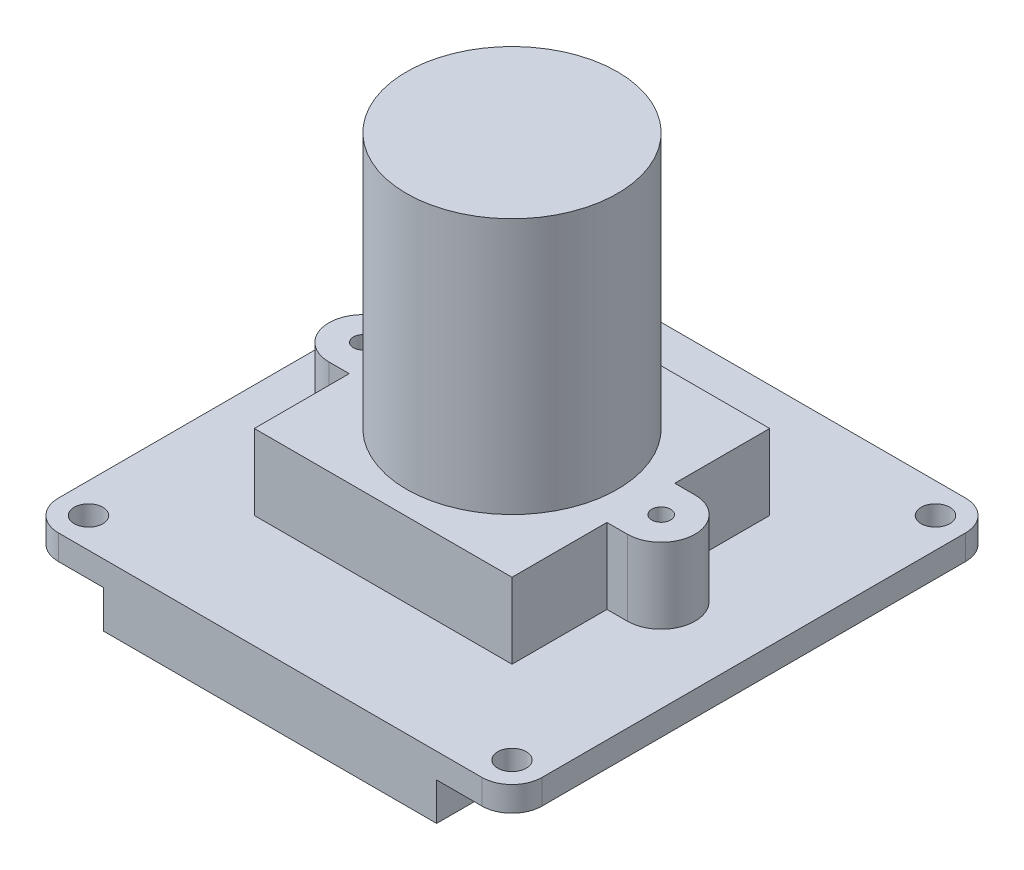
ISO-10303-21;
HEADER;
FILE_DESCRIPTION(('STEP AP214'),'2;1');
FILE_NAME('part.step','',(''),(''),'','','');
FILE_SCHEMA(('AUTOMOTIVE_DESIGN { 1 0 10303 214 1 1 1 1 }'));
ENDSEC;
DATA;
#1=APPLICATION_CONTEXT('core data for automotive mechanical design processes');
#2=APPLICATION_PROTOCOL_DEFINITION('international standard','automotive_design',2000,#1);
#3=PRODUCT_CONTEXT('',#1,'mechanical');
#4=PRODUCT('Part','Part','',(#3));
#5=PRODUCT_RELATED_PRODUCT_CATEGORY('part','',(#4));
#6=PRODUCT_DEFINITION_FORMATION('','',#4);
#7=PRODUCT_DEFINITION_CONTEXT('part definition',#1,'design');
#8=PRODUCT_DEFINITION('design','',#6,#7);
#9=PRODUCT_DEFINITION_SHAPE('','',#8);
#10=(LENGTH_UNIT() NAMED_UNIT(*) SI_UNIT(.MILLI.,.METRE.));
#11=(NAMED_UNIT(*) PLANE_ANGLE_UNIT() SI_UNIT($,.RADIAN.));
#12=(NAMED_UNIT(*) SI_UNIT($,.STERADIAN.) SOLID_ANGLE_UNIT());
#13=UNCERTAINTY_MEASURE_WITH_UNIT(LENGTH_MEASURE(1.E-05),#10,'distance_accuracy_value','');
#14=(GEOMETRIC_REPRESENTATION_CONTEXT(3) GLOBAL_UNCERTAINTY_ASSIGNED_CONTEXT((#13)) GLOBAL_UNIT_ASSIGNED_CONTEXT((#10,
#11,#12)) REPRESENTATION_CONTEXT('',''));
#15=CARTESIAN_POINT('',(0.,0.,0.));
#16=DIRECTION('',(0.,0.,1.));
#17=DIRECTION('',(1.,0.,0.));
#18=AXIS2_PLACEMENT_3D('',#15,#16,#17);
#19=CARTESIAN_POINT('',(0.,0.,0.));
#20=DIRECTION('',(0.,1.,0.));
#21=DIRECTION('',(0.,0.,1.));
#22=AXIS2_PLACEMENT_3D('',#19,#20,#21);
#23=PLANE('',#22);
#24=CARTESIAN_POINT('',(-14.05,0.,14.05));
#25=DIRECTION('',(0.,1.,0.));
#26=DIRECTION('',(0.,0.,-1.));
#27=AXIS2_PLACEMENT_3D('',#24,#25,#26);
#28=CIRCLE('',#27,0.949999999999999);
#29=CARTESIAN_POINT('',(-14.05,0.,13.1));
#30=VERTEX_POINT('',#29);
#31=EDGE_CURVE('E261',#30,#30,#28,.T.);
#32=ORIENTED_EDGE('',*,*,#31,.T.);
#33=EDGE_LOOP('',(#32));
#34=FACE_BOUND('',#33,.T.);
#35=CARTESIAN_POINT('',(14.05,0.,14.05));
#36=DIRECTION('',(0.,1.,0.));
#37=DIRECTION('',(0.,0.,1.));
#38=AXIS2_PLACEMENT_3D('',#35,#36,#37);
#39=CIRCLE('',#38,0.949999999999999);
#40=CARTESIAN_POINT('',(14.05,0.,15.));
#41=VERTEX_POINT('',#40);
#42=EDGE_CURVE('E265',#41,#41,#39,.T.);
#43=ORIENTED_EDGE('',*,*,#42,.T.);
#44=EDGE_LOOP('',(#43));
#45=FACE_BOUND('',#44,.T.);
#46=CARTESIAN_POINT('',(14.05,0.,-14.05));
#47=DIRECTION('',(0.,1.,0.));
#48=DIRECTION('',(0.,0.,-1.));
#49=AXIS2_PLACEMENT_3D('',#46,#47,#48);
#50=CIRCLE('',#49,0.949999999999999);
#51=CARTESIAN_POINT('',(14.05,0.,-15.));
#52=VERTEX_POINT('',#51);
#53=EDGE_CURVE('E271',#52,#52,#50,.T.);
#54=ORIENTED_EDGE('',*,*,#53,.T.);
#55=EDGE_LOOP('',(#54));
#56=FACE_BOUND('',#55,.T.);
#57=CARTESIAN_POINT('',(-14.05,0.,-14.05));
#58=DIRECTION('',(0.,1.,0.));
#59=DIRECTION('',(0.,0.,1.));
#60=AXIS2_PLACEMENT_3D('',#57,#58,#59);
#61=CIRCLE('',#60,0.949999999999999);
#62=CARTESIAN_POINT('',(-14.05,0.,-13.1));
#63=VERTEX_POINT('',#62);
#64=EDGE_CURVE('E277',#63,#63,#61,.T.);
#65=ORIENTED_EDGE('',*,*,#64,.T.);
#66=EDGE_LOOP('',(#65));
#67=FACE_BOUND('',#66,.T.);
#68=DIRECTION('',(-1.,0.,0.));
#69=VECTOR('',#68,1.);
#70=CARTESIAN_POINT('',(-16.05,0.,-16.05));
#71=LINE('',#70,#69);
#72=CARTESIAN_POINT('',(14.05,0.,-16.05));
#73=VERTEX_POINT('',#72);
#74=CARTESIAN_POINT('',(-14.05,0.,-16.05));
#75=VERTEX_POINT('',#74);
#76=EDGE_CURVE('E289',#73,#75,#71,.T.);
#77=ORIENTED_EDGE('',*,*,#76,.F.);
#78=CARTESIAN_POINT('',(14.05,0.,-14.05));
#79=DIRECTION('',(0.,1.,0.));
#80=DIRECTION('',(0.,0.,1.));
#81=AXIS2_PLACEMENT_3D('',#78,#79,#80);
#82=CIRCLE('',#81,2.);
#83=CARTESIAN_POINT('',(16.05,0.,-14.05));
#84=VERTEX_POINT('',#83);
#85=EDGE_CURVE('E318',#73,#84,#82,.F.);
#86=ORIENTED_EDGE('',*,*,#85,.T.);
#87=DIRECTION('',(0.,0.,-1.));
#88=VECTOR('',#87,1.);
#89=CARTESIAN_POINT('',(16.05,0.,-16.05));
#90=LINE('',#89,#88);
#91=CARTESIAN_POINT('',(16.05,0.,14.05));
#92=VERTEX_POINT('',#91);
#93=EDGE_CURVE('E303',#92,#84,#90,.T.);
#94=ORIENTED_EDGE('',*,*,#93,.F.);
#95=CARTESIAN_POINT('',(14.05,0.,14.05));
#96=DIRECTION('',(0.,1.,0.));
#97=DIRECTION('',(0.,0.,1.));
#98=AXIS2_PLACEMENT_3D('',#95,#96,#97);
#99=CIRCLE('',#98,2.);
#100=CARTESIAN_POINT('',(14.05,0.,16.05));
#101=VERTEX_POINT('',#100);
#102=EDGE_CURVE('E316',#92,#101,#99,.F.);
#103=ORIENTED_EDGE('',*,*,#102,.T.);
#104=DIRECTION('',(1.,0.,0.));
#105=VECTOR('',#104,1.);
#106=CARTESIAN_POINT('',(-16.05,0.,16.05));
#107=LINE('',#106,#105);
#108=CARTESIAN_POINT('',(11.05,0.,16.05));
#109=VERTEX_POINT('',#108);
#110=EDGE_CURVE('E300',#109,#101,#107,.T.);
#111=ORIENTED_EDGE('',*,*,#110,.F.);
#112=DIRECTION('',(0.,0.,1.));
#113=VECTOR('',#112,1.);
#114=CARTESIAN_POINT('',(11.05,0.,16.05));
#115=LINE('',#114,#113);
#116=CARTESIAN_POINT('',(11.05,0.,9.3));
#117=VERTEX_POINT('',#116);
#118=EDGE_CURVE('E239',#117,#109,#115,.T.);
#119=ORIENTED_EDGE('',*,*,#118,.F.);
#120=DIRECTION('',(1.,0.,0.));
#121=VECTOR('',#120,1.);
#122=CARTESIAN_POINT('',(-11.05,0.,9.3));
#123=LINE('',#122,#121);
#124=CARTESIAN_POINT('',(-11.05,0.,9.3));
#125=VERTEX_POINT('',#124);
#126=EDGE_CURVE('E229',#125,#117,#123,.T.);
#127=ORIENTED_EDGE('',*,*,#126,.F.);
#128=DIRECTION('',(0.,0.,-1.));
#129=VECTOR('',#128,1.);
#130=CARTESIAN_POINT('',(-11.05,0.,16.05));
#131=LINE('',#130,#129);
#132=CARTESIAN_POINT('',(-11.05,0.,16.05));
#133=VERTEX_POINT('',#132);
#134=EDGE_CURVE('E226',#133,#125,#131,.T.);
#135=ORIENTED_EDGE('',*,*,#134,.F.);
#136=CARTESIAN_POINT('',(-14.05,0.,16.05));
#137=VERTEX_POINT('',#136);
#138=EDGE_CURVE('E301',#137,#133,#107,.T.);
#139=ORIENTED_EDGE('',*,*,#138,.F.);
#140=CARTESIAN_POINT('',(-14.05,0.,14.05));
#141=DIRECTION('',(0.,1.,0.));
#142=DIRECTION('',(0.,0.,1.));
#143=AXIS2_PLACEMENT_3D('',#140,#141,#142);
#144=CIRCLE('',#143,2.);
#145=CARTESIAN_POINT('',(-16.05,0.,14.05));
#146=VERTEX_POINT('',#145);
#147=EDGE_CURVE('E314',#137,#146,#144,.F.);
#148=ORIENTED_EDGE('',*,*,#147,.T.);
#149=DIRECTION('',(0.,0.,1.));
#150=VECTOR('',#149,1.);
#151=CARTESIAN_POINT('',(-16.05,0.,-16.05));
#152=LINE('',#151,#150);
#153=CARTESIAN_POINT('',(-16.05,0.,-14.05));
#154=VERTEX_POINT('',#153);
#155=EDGE_CURVE('E283',#154,#146,#152,.T.);
#156=ORIENTED_EDGE('',*,*,#155,.F.);
#157=CARTESIAN_POINT('',(-14.05,0.,-14.05));
#158=DIRECTION('',(0.,1.,0.));
#159=DIRECTION('',(0.,0.,1.));
#160=AXIS2_PLACEMENT_3D('',#157,#158,#159);
#161=CIRCLE('',#160,2.);
#162=EDGE_CURVE('E312',#154,#75,#161,.F.);
#163=ORIENTED_EDGE('',*,*,#162,.T.);
#164=EDGE_LOOP('',(#77,#86,#94,#103,#111,#119,#127,#135,#139,#148,#156,#163));
#165=FACE_BOUND('',#164,.T.);
#166=ADVANCED_FACE('F38',(#34,#45,#56,#67,#165),#23,.F.);
#167=CARTESIAN_POINT('',(0.,1.65,0.));
#168=DIRECTION('',(0.,1.,0.));
#169=DIRECTION('',(0.,0.,1.));
#170=AXIS2_PLACEMENT_3D('',#167,#168,#169);
#171=PLANE('',#170);
#172=DIRECTION('',(0.,0.,1.));
#173=VECTOR('',#172,1.);
#174=CARTESIAN_POINT('',(-8.55,1.65,-8.55));
#175=LINE('',#174,#173);
#176=CARTESIAN_POINT('',(-8.55,1.65,-8.55));
#177=VERTEX_POINT('',#176);
#178=CARTESIAN_POINT('',(-8.55,1.65,-2.25));
#179=VERTEX_POINT('',#178);
#180=EDGE_CURVE('E225',#177,#179,#175,.T.);
#181=ORIENTED_EDGE('',*,*,#180,.F.);
#182=DIRECTION('',(-1.,0.,0.));
#183=VECTOR('',#182,1.);
#184=CARTESIAN_POINT('',(-8.55,1.65,-8.55));
#185=LINE('',#184,#183);
#186=CARTESIAN_POINT('',(8.55,1.65,-8.55));
#187=VERTEX_POINT('',#186);
#188=EDGE_CURVE('E222',#187,#177,#185,.T.);
#189=ORIENTED_EDGE('',*,*,#188,.F.);
#190=DIRECTION('',(0.,0.,-1.));
#191=VECTOR('',#190,1.);
#192=CARTESIAN_POINT('',(8.55,1.65,-8.55));
#193=LINE('',#192,#191);
#194=CARTESIAN_POINT('',(8.55,1.65,-2.25));
#195=VERTEX_POINT('',#194);
#196=EDGE_CURVE('E808',#195,#187,#193,.T.);
#197=ORIENTED_EDGE('',*,*,#196,.F.);
#198=DIRECTION('',(-1.,0.,0.));
#199=VECTOR('',#198,1.);
#200=CARTESIAN_POINT('',(9.9,1.65,-2.25));
#201=LINE('',#200,#199);
#202=CARTESIAN_POINT('',(9.9,1.65,-2.25));
#203=VERTEX_POINT('',#202);
#204=EDGE_CURVE('E805',#203,#195,#201,.T.);
#205=ORIENTED_EDGE('',*,*,#204,.F.);
#206=CARTESIAN_POINT('',(9.9,1.65,0.));
#207=DIRECTION('',(0.,1.,0.));
#208=DIRECTION('',(0.,0.,-1.));
#209=AXIS2_PLACEMENT_3D('',#206,#207,#208);
#210=CIRCLE('',#209,2.25);
#211=CARTESIAN_POINT('',(9.9,1.65,2.25));
#212=VERTEX_POINT('',#211);
#213=EDGE_CURVE('E802',#212,#203,#210,.T.);
#214=ORIENTED_EDGE('',*,*,#213,.F.);
#215=DIRECTION('',(1.,0.,0.));
#216=VECTOR('',#215,1.);
#217=CARTESIAN_POINT('',(9.9,1.65,2.25));
#218=LINE('',#217,#216);
#219=CARTESIAN_POINT('',(8.55,1.65,2.25));
#220=VERTEX_POINT('',#219);
#221=EDGE_CURVE('E799',#220,#212,#218,.T.);
#222=ORIENTED_EDGE('',*,*,#221,.F.);
#223=DIRECTION('',(0.,0.,-1.));
#224=VECTOR('',#223,1.);
#225=CARTESIAN_POINT('',(8.55,1.65,2.25));
#226=LINE('',#225,#224);
#227=CARTESIAN_POINT('',(8.55,1.65,8.55));
#228=VERTEX_POINT('',#227);
#229=EDGE_CURVE('E796',#228,#220,#226,.T.);
#230=ORIENTED_EDGE('',*,*,#229,.F.);
#231=DIRECTION('',(1.,0.,0.));
#232=VECTOR('',#231,1.);
#233=CARTESIAN_POINT('',(-8.55,1.65,8.55));
#234=LINE('',#233,#232);
#235=CARTESIAN_POINT('',(-8.55,1.65,8.55));
#236=VERTEX_POINT('',#235);
#237=EDGE_CURVE('E793',#236,#228,#234,.T.);
#238=ORIENTED_EDGE('',*,*,#237,.F.);
#239=DIRECTION('',(0.,0.,1.));
#240=VECTOR('',#239,1.);
#241=CARTESIAN_POINT('',(-8.55,1.65,2.25));
#242=LINE('',#241,#240);
#243=CARTESIAN_POINT('',(-8.55,1.65,2.25));
#244=VERTEX_POINT('',#243);
#245=EDGE_CURVE('E790',#244,#236,#242,.T.);
#246=ORIENTED_EDGE('',*,*,#245,.F.);
#247=DIRECTION('',(1.,0.,0.));
#248=VECTOR('',#247,1.);
#249=CARTESIAN_POINT('',(-9.9,1.65,2.25));
#250=LINE('',#249,#248);
#251=CARTESIAN_POINT('',(-9.9,1.65,2.25));
#252=VERTEX_POINT('',#251);
#253=EDGE_CURVE('E787',#252,#244,#250,.T.);
#254=ORIENTED_EDGE('',*,*,#253,.F.);
#255=CARTESIAN_POINT('',(-9.9,1.65,0.));
#256=DIRECTION('',(0.,1.,0.));
#257=DIRECTION('',(0.,0.,1.));
#258=AXIS2_PLACEMENT_3D('',#255,#256,#257);
#259=CIRCLE('',#258,2.25);
#260=CARTESIAN_POINT('',(-9.9,1.65,-2.25));
#261=VERTEX_POINT('',#260);
#262=EDGE_CURVE('E784',#261,#252,#259,.T.);
#263=ORIENTED_EDGE('',*,*,#262,.F.);
#264=DIRECTION('',(-1.,0.,0.));
#265=VECTOR('',#264,1.);
#266=CARTESIAN_POINT('',(-9.9,1.65,-2.25));
#267=LINE('',#266,#265);
#268=EDGE_CURVE('E782',#179,#261,#267,.T.);
#269=ORIENTED_EDGE('',*,*,#268,.F.);
#270=EDGE_LOOP('',(#181,#189,#197,#205,#214,#222,#230,#238,#246,#254,#263,#269));
#271=FACE_BOUND('',#270,.T.);
#272=CARTESIAN_POINT('',(14.05,1.65,14.05));
#273=DIRECTION('',(0.,1.,0.));
#274=DIRECTION('',(0.,0.,1.));
#275=AXIS2_PLACEMENT_3D('',#272,#273,#274);
#276=CIRCLE('',#275,0.949999999999999);
#277=CARTESIAN_POINT('',(14.05,1.65,15.));
#278=VERTEX_POINT('',#277);
#279=EDGE_CURVE('E268',#278,#278,#276,.T.);
#280=ORIENTED_EDGE('',*,*,#279,.F.);
#281=EDGE_LOOP('',(#280));
#282=FACE_BOUND('',#281,.T.);
#283=CARTESIAN_POINT('',(-14.05,1.65,-14.05));
#284=DIRECTION('',(0.,1.,0.));
#285=DIRECTION('',(0.,0.,1.));
#286=AXIS2_PLACEMENT_3D('',#283,#284,#285);
#287=CIRCLE('',#286,0.949999999999999);
#288=CARTESIAN_POINT('',(-14.05,1.65,-13.1));
#289=VERTEX_POINT('',#288);
#290=EDGE_CURVE('E280',#289,#289,#287,.T.);
#291=ORIENTED_EDGE('',*,*,#290,.F.);
#292=EDGE_LOOP('',(#291));
#293=FACE_BOUND('',#292,.T.);
#294=DIRECTION('',(0.,0.,-1.));
#295=VECTOR('',#294,1.);
#296=CARTESIAN_POINT('',(16.05,1.65,-16.05));
#297=LINE('',#296,#295);
#298=CARTESIAN_POINT('',(16.05,1.65,14.05));
#299=VERTEX_POINT('',#298);
#300=CARTESIAN_POINT('',(16.05,1.65,-14.05));
#301=VERTEX_POINT('',#300);
#302=EDGE_CURVE('E291',#299,#301,#297,.T.);
#303=ORIENTED_EDGE('',*,*,#302,.T.);
#304=CARTESIAN_POINT('',(14.05,1.65,-14.05));
#305=DIRECTION('',(0.,1.,0.));
#306=DIRECTION('',(0.,0.,1.));
#307=AXIS2_PLACEMENT_3D('',#304,#305,#306);
#308=CIRCLE('',#307,2.);
#309=CARTESIAN_POINT('',(14.05,1.65,-16.05));
#310=VERTEX_POINT('',#309);
#311=EDGE_CURVE('E330',#301,#310,#308,.T.);
#312=ORIENTED_EDGE('',*,*,#311,.T.);
#313=DIRECTION('',(-1.,0.,0.));
#314=VECTOR('',#313,1.);
#315=CARTESIAN_POINT('',(-16.05,1.65,-16.05));
#316=LINE('',#315,#314);
#317=CARTESIAN_POINT('',(-14.05,1.65,-16.05));
#318=VERTEX_POINT('',#317);
#319=EDGE_CURVE('E294',#310,#318,#316,.T.);
#320=ORIENTED_EDGE('',*,*,#319,.T.);
#321=CARTESIAN_POINT('',(-14.05,1.65,-14.05));
#322=DIRECTION('',(0.,1.,0.));
#323=DIRECTION('',(0.,0.,1.));
#324=AXIS2_PLACEMENT_3D('',#321,#322,#323);
#325=CIRCLE('',#324,2.);
#326=CARTESIAN_POINT('',(-16.05,1.65,-14.05));
#327=VERTEX_POINT('',#326);
#328=EDGE_CURVE('E325',#318,#327,#325,.T.);
#329=ORIENTED_EDGE('',*,*,#328,.T.);
#330=DIRECTION('',(0.,0.,1.));
#331=VECTOR('',#330,1.);
#332=CARTESIAN_POINT('',(-16.05,1.65,-16.05));
#333=LINE('',#332,#331);
#334=CARTESIAN_POINT('',(-16.05,1.65,14.05));
#335=VERTEX_POINT('',#334);
#336=EDGE_CURVE('E286',#327,#335,#333,.T.);
#337=ORIENTED_EDGE('',*,*,#336,.T.);
#338=CARTESIAN_POINT('',(-14.05,1.65,14.05));
#339=DIRECTION('',(0.,1.,0.));
#340=DIRECTION('',(0.,0.,1.));
#341=AXIS2_PLACEMENT_3D('',#338,#339,#340);
#342=CIRCLE('',#341,2.);
#343=CARTESIAN_POINT('',(-14.05,1.65,16.05));
#344=VERTEX_POINT('',#343);
#345=EDGE_CURVE('E60',#335,#344,#342,.T.);
#346=ORIENTED_EDGE('',*,*,#345,.T.);
#347=DIRECTION('',(1.,0.,0.));
#348=VECTOR('',#347,1.);
#349=CARTESIAN_POINT('',(-16.05,1.65,16.05));
#350=LINE('',#349,#348);
#351=CARTESIAN_POINT('',(14.05,1.65,16.05));
#352=VERTEX_POINT('',#351);
#353=EDGE_CURVE('E288',#344,#352,#350,.T.);
#354=ORIENTED_EDGE('',*,*,#353,.T.);
#355=CARTESIAN_POINT('',(14.05,1.65,14.05));
#356=DIRECTION('',(0.,1.,0.));
#357=DIRECTION('',(0.,0.,1.));
#358=AXIS2_PLACEMENT_3D('',#355,#356,#357);
#359=CIRCLE('',#358,2.);
#360=EDGE_CURVE('E328',#352,#299,#359,.T.);
#361=ORIENTED_EDGE('',*,*,#360,.T.);
#362=EDGE_LOOP('',(#303,#312,#320,#329,#337,#346,#354,#361));
#363=FACE_BOUND('',#362,.T.);
#364=CARTESIAN_POINT('',(14.05,1.65,-14.05));
#365=DIRECTION('',(0.,1.,0.));
#366=DIRECTION('',(0.,0.,-1.));
#367=AXIS2_PLACEMENT_3D('',#364,#365,#366);
#368=CIRCLE('',#367,0.949999999999999);
#369=CARTESIAN_POINT('',(14.05,1.65,-15.));
#370=VERTEX_POINT('',#369);
#371=EDGE_CURVE('E274',#370,#370,#368,.T.);
#372=ORIENTED_EDGE('',*,*,#371,.F.);
#373=EDGE_LOOP('',(#372));
#374=FACE_BOUND('',#373,.T.);
#375=CARTESIAN_POINT('',(-14.05,1.65,14.05));
#376=DIRECTION('',(0.,1.,0.));
#377=DIRECTION('',(0.,0.,-1.));
#378=AXIS2_PLACEMENT_3D('',#375,#376,#377);
#379=CIRCLE('',#378,0.949999999999999);
#380=CARTESIAN_POINT('',(-14.05,1.65,13.1));
#381=VERTEX_POINT('',#380);
#382=EDGE_CURVE('E262',#381,#381,#379,.T.);
#383=ORIENTED_EDGE('',*,*,#382,.F.);
#384=EDGE_LOOP('',(#383));
#385=FACE_BOUND('',#384,.T.);
#386=ADVANCED_FACE('F354',(#271,#282,#293,#363,#374,#385),#171,.T.);
#387=CARTESIAN_POINT('',(-16.05,1.65,-16.05));
#388=DIRECTION('',(1.,0.,0.));
#389=DIRECTION('',(0.,0.,-1.));
#390=AXIS2_PLACEMENT_3D('',#387,#388,#389);
#391=PLANE('',#390);
#392=ORIENTED_EDGE('',*,*,#155,.T.);
#393=DIRECTION('',(0.,-1.,0.));
#394=VECTOR('',#393,1.);
#395=CARTESIAN_POINT('',(-16.05,1.65,14.05));
#396=LINE('',#395,#394);
#397=EDGE_CURVE('E11',#146,#335,#396,.F.);
#398=ORIENTED_EDGE('',*,*,#397,.T.);
#399=ORIENTED_EDGE('',*,*,#336,.F.);
#400=DIRECTION('',(0.,-1.,0.));
#401=VECTOR('',#400,1.);
#402=CARTESIAN_POINT('',(-16.05,1.65,-14.05));
#403=LINE('',#402,#401);
#404=EDGE_CURVE('E46',#327,#154,#403,.T.);
#405=ORIENTED_EDGE('',*,*,#404,.T.);
#406=EDGE_LOOP('',(#392,#398,#399,#405));
#407=FACE_BOUND('',#406,.T.);
#408=ADVANCED_FACE('F340',(#407),#391,.F.);
#409=CARTESIAN_POINT('',(-16.05,1.65,16.05));
#410=DIRECTION('',(0.,0.,-1.));
#411=DIRECTION('',(-1.,0.,0.));
#412=AXIS2_PLACEMENT_3D('',#409,#410,#411);
#413=PLANE('',#412);
#414=ORIENTED_EDGE('',*,*,#110,.T.);
#415=DIRECTION('',(0.,-1.,0.));
#416=VECTOR('',#415,1.);
#417=CARTESIAN_POINT('',(14.05,1.65,16.05));
#418=LINE('',#417,#416);
#419=EDGE_CURVE('E53',#101,#352,#418,.F.);
#420=ORIENTED_EDGE('',*,*,#419,.T.);
#421=ORIENTED_EDGE('',*,*,#353,.F.);
#422=DIRECTION('',(0.,-1.,0.));
#423=VECTOR('',#422,1.);
#424=CARTESIAN_POINT('',(-14.05,1.65,16.05));
#425=LINE('',#424,#423);
#426=EDGE_CURVE('E332',#344,#137,#425,.T.);
#427=ORIENTED_EDGE('',*,*,#426,.T.);
#428=ORIENTED_EDGE('',*,*,#138,.T.);
#429=DIRECTION('',(0.,1.,0.));
#430=VECTOR('',#429,1.);
#431=CARTESIAN_POINT('',(-11.05,-2.5,16.05));
#432=LINE('',#431,#430);
#433=CARTESIAN_POINT('',(-11.05,-2.5,16.05));
#434=VERTEX_POINT('',#433);
#435=EDGE_CURVE('E244',#434,#133,#432,.T.);
#436=ORIENTED_EDGE('',*,*,#435,.F.);
#437=DIRECTION('',(-1.,0.,0.));
#438=VECTOR('',#437,1.);
#439=CARTESIAN_POINT('',(-11.05,-2.5,16.05));
#440=LINE('',#439,#438);
#441=CARTESIAN_POINT('',(11.05,-2.5,16.05));
#442=VERTEX_POINT('',#441);
#443=EDGE_CURVE('E243',#442,#434,#440,.T.);
#444=ORIENTED_EDGE('',*,*,#443,.F.);
#445=DIRECTION('',(0.,1.,0.));
#446=VECTOR('',#445,1.);
#447=CARTESIAN_POINT('',(11.05,-2.5,16.05));
#448=LINE('',#447,#446);
#449=EDGE_CURVE('E252',#442,#109,#448,.T.);
#450=ORIENTED_EDGE('',*,*,#449,.T.);
#451=EDGE_LOOP('',(#414,#420,#421,#427,#428,#436,#444,#450));
#452=FACE_BOUND('',#451,.T.);
#453=ADVANCED_FACE('F351',(#452),#413,.F.);
#454=CARTESIAN_POINT('',(16.05,1.65,-16.05));
#455=DIRECTION('',(-1.,0.,0.));
#456=DIRECTION('',(0.,0.,1.));
#457=AXIS2_PLACEMENT_3D('',#454,#455,#456);
#458=PLANE('',#457);
#459=ORIENTED_EDGE('',*,*,#93,.T.);
#460=DIRECTION('',(0.,-1.,0.));
#461=VECTOR('',#460,1.);
#462=CARTESIAN_POINT('',(16.05,1.65,-14.05));
#463=LINE('',#462,#461);
#464=EDGE_CURVE('E323',#84,#301,#463,.F.);
#465=ORIENTED_EDGE('',*,*,#464,.T.);
#466=ORIENTED_EDGE('',*,*,#302,.F.);
#467=DIRECTION('',(0.,-1.,0.));
#468=VECTOR('',#467,1.);
#469=CARTESIAN_POINT('',(16.05,1.65,14.05));
#470=LINE('',#469,#468);
#471=EDGE_CURVE('E320',#299,#92,#470,.T.);
#472=ORIENTED_EDGE('',*,*,#471,.T.);
#473=EDGE_LOOP('',(#459,#465,#466,#472));
#474=FACE_BOUND('',#473,.T.);
#475=ADVANCED_FACE('F362',(#474),#458,.F.);
#476=CARTESIAN_POINT('',(-16.05,1.65,-16.05));
#477=DIRECTION('',(0.,0.,1.));
#478=DIRECTION('',(1.,0.,0.));
#479=AXIS2_PLACEMENT_3D('',#476,#477,#478);
#480=PLANE('',#479);
#481=ORIENTED_EDGE('',*,*,#319,.F.);
#482=DIRECTION('',(0.,-1.,0.));
#483=VECTOR('',#482,1.);
#484=CARTESIAN_POINT('',(14.05,1.65,-16.05));
#485=LINE('',#484,#483);
#486=EDGE_CURVE('E309',#310,#73,#485,.T.);
#487=ORIENTED_EDGE('',*,*,#486,.T.);
#488=ORIENTED_EDGE('',*,*,#76,.T.);
#489=DIRECTION('',(0.,-1.,0.));
#490=VECTOR('',#489,1.);
#491=CARTESIAN_POINT('',(-14.05,1.65,-16.05));
#492=LINE('',#491,#490);
#493=EDGE_CURVE('E297',#75,#318,#492,.F.);
#494=ORIENTED_EDGE('',*,*,#493,.T.);
#495=EDGE_LOOP('',(#481,#487,#488,#494));
#496=FACE_BOUND('',#495,.T.);
#497=ADVANCED_FACE('F370',(#496),#480,.F.);
#498=CARTESIAN_POINT('',(-14.05,1.65,-14.05));
#499=DIRECTION('',(0.,-1.,0.));
#500=DIRECTION('',(0.,0.,-1.));
#501=AXIS2_PLACEMENT_3D('',#498,#499,#500);
#502=CYLINDRICAL_SURFACE('',#501,0.949999999999999);
#503=ORIENTED_EDGE('',*,*,#290,.T.);
#504=EDGE_LOOP('',(#503));
#505=FACE_BOUND('',#504,.T.);
#506=ORIENTED_EDGE('',*,*,#64,.F.);
#507=EDGE_LOOP('',(#506));
#508=FACE_BOUND('',#507,.T.);
#509=ADVANCED_FACE('F392',(#505,#508),#502,.F.);
#510=CARTESIAN_POINT('',(14.05,1.65,-14.05));
#511=DIRECTION('',(0.,-1.,0.));
#512=DIRECTION('',(0.,0.,-1.));
#513=AXIS2_PLACEMENT_3D('',#510,#511,#512);
#514=CYLINDRICAL_SURFACE('',#513,0.949999999999999);
#515=ORIENTED_EDGE('',*,*,#371,.T.);
#516=EDGE_LOOP('',(#515));
#517=FACE_BOUND('',#516,.T.);
#518=ORIENTED_EDGE('',*,*,#53,.F.);
#519=EDGE_LOOP('',(#518));
#520=FACE_BOUND('',#519,.T.);
#521=ADVANCED_FACE('F654',(#517,#520),#514,.F.);
#522=CARTESIAN_POINT('',(14.05,1.65,14.05));
#523=DIRECTION('',(0.,-1.,0.));
#524=DIRECTION('',(0.,0.,-1.));
#525=AXIS2_PLACEMENT_3D('',#522,#523,#524);
#526=CYLINDRICAL_SURFACE('',#525,0.949999999999999);
#527=ORIENTED_EDGE('',*,*,#279,.T.);
#528=EDGE_LOOP('',(#527));
#529=FACE_BOUND('',#528,.T.);
#530=ORIENTED_EDGE('',*,*,#42,.F.);
#531=EDGE_LOOP('',(#530));
#532=FACE_BOUND('',#531,.T.);
#533=ADVANCED_FACE('F645',(#529,#532),#526,.F.);
#534=CARTESIAN_POINT('',(-14.05,1.65,14.05));
#535=DIRECTION('',(0.,-1.,0.));
#536=DIRECTION('',(0.,0.,-1.));
#537=AXIS2_PLACEMENT_3D('',#534,#535,#536);
#538=CYLINDRICAL_SURFACE('',#537,0.949999999999999);
#539=ORIENTED_EDGE('',*,*,#382,.T.);
#540=EDGE_LOOP('',(#539));
#541=FACE_BOUND('',#540,.T.);
#542=ORIENTED_EDGE('',*,*,#31,.F.);
#543=EDGE_LOOP('',(#542));
#544=FACE_BOUND('',#543,.T.);
#545=ADVANCED_FACE('F619',(#541,#544),#538,.F.);
#546=CARTESIAN_POINT('',(-11.05,-2.5,16.05));
#547=DIRECTION('',(1.,0.,0.));
#548=DIRECTION('',(0.,0.,-1.));
#549=AXIS2_PLACEMENT_3D('',#546,#547,#548);
#550=PLANE('',#549);
#551=ORIENTED_EDGE('',*,*,#134,.T.);
#552=DIRECTION('',(0.,1.,0.));
#553=VECTOR('',#552,1.);
#554=CARTESIAN_POINT('',(-11.05,-2.5,9.3));
#555=LINE('',#554,#553);
#556=CARTESIAN_POINT('',(-11.05,-2.5,9.3));
#557=VERTEX_POINT('',#556);
#558=EDGE_CURVE('E258',#557,#125,#555,.T.);
#559=ORIENTED_EDGE('',*,*,#558,.F.);
#560=DIRECTION('',(0.,0.,-1.));
#561=VECTOR('',#560,1.);
#562=CARTESIAN_POINT('',(-11.05,-2.5,16.05));
#563=LINE('',#562,#561);
#564=EDGE_CURVE('E235',#434,#557,#563,.T.);
#565=ORIENTED_EDGE('',*,*,#564,.F.);
#566=ORIENTED_EDGE('',*,*,#435,.T.);
#567=EDGE_LOOP('',(#551,#559,#565,#566));
#568=FACE_BOUND('',#567,.T.);
#569=ADVANCED_FACE('F610',(#568),#550,.F.);
#570=CARTESIAN_POINT('',(-11.05,-2.5,9.3));
#571=DIRECTION('',(0.,0.,1.));
#572=DIRECTION('',(1.,0.,0.));
#573=AXIS2_PLACEMENT_3D('',#570,#571,#572);
#574=PLANE('',#573);
#575=ORIENTED_EDGE('',*,*,#126,.T.);
#576=DIRECTION('',(0.,1.,0.));
#577=VECTOR('',#576,1.);
#578=CARTESIAN_POINT('',(11.05,-2.5,9.3));
#579=LINE('',#578,#577);
#580=CARTESIAN_POINT('',(11.05,-2.5,9.3));
#581=VERTEX_POINT('',#580);
#582=EDGE_CURVE('E255',#581,#117,#579,.T.);
#583=ORIENTED_EDGE('',*,*,#582,.F.);
#584=DIRECTION('',(1.,0.,0.));
#585=VECTOR('',#584,1.);
#586=CARTESIAN_POINT('',(-11.05,-2.5,9.3));
#587=LINE('',#586,#585);
#588=EDGE_CURVE('E238',#557,#581,#587,.T.);
#589=ORIENTED_EDGE('',*,*,#588,.F.);
#590=ORIENTED_EDGE('',*,*,#558,.T.);
#591=EDGE_LOOP('',(#575,#583,#589,#590));
#592=FACE_BOUND('',#591,.T.);
#593=ADVANCED_FACE('F601',(#592),#574,.F.);
#594=CARTESIAN_POINT('',(11.05,-2.5,16.05));
#595=DIRECTION('',(-1.,0.,0.));
#596=DIRECTION('',(0.,0.,1.));
#597=AXIS2_PLACEMENT_3D('',#594,#595,#596);
#598=PLANE('',#597);
#599=ORIENTED_EDGE('',*,*,#118,.T.);
#600=ORIENTED_EDGE('',*,*,#449,.F.);
#601=DIRECTION('',(0.,0.,1.));
#602=VECTOR('',#601,1.);
#603=CARTESIAN_POINT('',(11.05,-2.5,16.05));
#604=LINE('',#603,#602);
#605=EDGE_CURVE('E241',#581,#442,#604,.T.);
#606=ORIENTED_EDGE('',*,*,#605,.F.);
#607=ORIENTED_EDGE('',*,*,#582,.T.);
#608=EDGE_LOOP('',(#599,#600,#606,#607));
#609=FACE_BOUND('',#608,.T.);
#610=ADVANCED_FACE('F592',(#609),#598,.F.);
#611=CARTESIAN_POINT('',(0.,-2.5,0.));
#612=DIRECTION('',(0.,-1.,0.));
#613=DIRECTION('',(0.,0.,-1.));
#614=AXIS2_PLACEMENT_3D('',#611,#612,#613);
#615=PLANE('',#614);
#616=ORIENTED_EDGE('',*,*,#564,.T.);
#617=ORIENTED_EDGE('',*,*,#588,.T.);
#618=ORIENTED_EDGE('',*,*,#605,.T.);
#619=ORIENTED_EDGE('',*,*,#443,.T.);
#620=EDGE_LOOP('',(#616,#617,#618,#619));
#621=FACE_BOUND('',#620,.T.);
#622=ADVANCED_FACE('F571',(#621),#615,.T.);
#623=CARTESIAN_POINT('',(-9.9,6.65,0.));
#624=DIRECTION('',(0.,1.,0.));
#625=DIRECTION('',(0.,0.,1.));
#626=AXIS2_PLACEMENT_3D('',#623,#624,#625);
#627=PLANE('',#626);
#628=CARTESIAN_POINT('',(0.,6.65,0.));
#629=DIRECTION('',(0.,1.,0.));
#630=DIRECTION('',(0.,0.,1.));
#631=AXIS2_PLACEMENT_3D('',#628,#629,#630);
#632=CIRCLE('',#631,7.);
#633=CARTESIAN_POINT('',(0.,6.65,7.));
#634=VERTEX_POINT('',#633);
#635=EDGE_CURVE('E753',#634,#634,#632,.T.);
#636=ORIENTED_EDGE('',*,*,#635,.F.);
#637=EDGE_LOOP('',(#636));
#638=FACE_BOUND('',#637,.T.);
#639=CARTESIAN_POINT('',(9.9,6.65,0.));
#640=DIRECTION('',(0.,1.,0.));
#641=DIRECTION('',(0.,0.,1.));
#642=AXIS2_PLACEMENT_3D('',#639,#640,#641);
#643=CIRCLE('',#642,0.625000000000001);
#644=CARTESIAN_POINT('',(9.9,6.65,0.624999999999999));
#645=VERTEX_POINT('',#644);
#646=EDGE_CURVE('E757',#645,#645,#643,.T.);
#647=ORIENTED_EDGE('',*,*,#646,.F.);
#648=EDGE_LOOP('',(#647));
#649=FACE_BOUND('',#648,.T.);
#650=DIRECTION('',(0.,0.,1.));
#651=VECTOR('',#650,1.);
#652=CARTESIAN_POINT('',(-8.55,6.65,-8.55));
#653=LINE('',#652,#651);
#654=CARTESIAN_POINT('',(-8.55,6.65,-8.55));
#655=VERTEX_POINT('',#654);
#656=CARTESIAN_POINT('',(-8.55,6.65,-2.25));
#657=VERTEX_POINT('',#656);
#658=EDGE_CURVE('E212',#655,#657,#653,.T.);
#659=ORIENTED_EDGE('',*,*,#658,.T.);
#660=DIRECTION('',(-1.,0.,0.));
#661=VECTOR('',#660,1.);
#662=CARTESIAN_POINT('',(-9.9,6.65,-2.25));
#663=LINE('',#662,#661);
#664=CARTESIAN_POINT('',(-9.9,6.65,-2.25));
#665=VERTEX_POINT('',#664);
#666=EDGE_CURVE('E200',#657,#665,#663,.T.);
#667=ORIENTED_EDGE('',*,*,#666,.T.);
#668=CARTESIAN_POINT('',(-9.9,6.65,0.));
#669=DIRECTION('',(0.,1.,0.));
#670=DIRECTION('',(0.,0.,1.));
#671=AXIS2_PLACEMENT_3D('',#668,#669,#670);
#672=CIRCLE('',#671,2.25);
#673=CARTESIAN_POINT('',(-9.9,6.65,2.25));
#674=VERTEX_POINT('',#673);
#675=EDGE_CURVE('E211',#665,#674,#672,.T.);
#676=ORIENTED_EDGE('',*,*,#675,.T.);
#677=DIRECTION('',(1.,0.,0.));
#678=VECTOR('',#677,1.);
#679=CARTESIAN_POINT('',(-9.9,6.65,2.25));
#680=LINE('',#679,#678);
#681=CARTESIAN_POINT('',(-8.55,6.65,2.25));
#682=VERTEX_POINT('',#681);
#683=EDGE_CURVE('E763',#674,#682,#680,.T.);
#684=ORIENTED_EDGE('',*,*,#683,.T.);
#685=DIRECTION('',(0.,0.,1.));
#686=VECTOR('',#685,1.);
#687=CARTESIAN_POINT('',(-8.55,6.65,2.25));
#688=LINE('',#687,#686);
#689=CARTESIAN_POINT('',(-8.55,6.65,8.55));
#690=VERTEX_POINT('',#689);
#691=EDGE_CURVE('E765',#682,#690,#688,.T.);
#692=ORIENTED_EDGE('',*,*,#691,.T.);
#693=DIRECTION('',(1.,0.,0.));
#694=VECTOR('',#693,1.);
#695=CARTESIAN_POINT('',(-8.55,6.65,8.55));
#696=LINE('',#695,#694);
#697=CARTESIAN_POINT('',(8.55,6.65,8.55));
#698=VERTEX_POINT('',#697);
#699=EDGE_CURVE('E767',#690,#698,#696,.T.);
#700=ORIENTED_EDGE('',*,*,#699,.T.);
#701=DIRECTION('',(0.,0.,-1.));
#702=VECTOR('',#701,1.);
#703=CARTESIAN_POINT('',(8.55,6.65,2.25));
#704=LINE('',#703,#702);
#705=CARTESIAN_POINT('',(8.55,6.65,2.25));
#706=VERTEX_POINT('',#705);
#707=EDGE_CURVE('E769',#698,#706,#704,.T.);
#708=ORIENTED_EDGE('',*,*,#707,.T.);
#709=DIRECTION('',(1.,0.,0.));
#710=VECTOR('',#709,1.);
#711=CARTESIAN_POINT('',(9.9,6.65,2.25));
#712=LINE('',#711,#710);
#713=CARTESIAN_POINT('',(9.9,6.65,2.25));
#714=VERTEX_POINT('',#713);
#715=EDGE_CURVE('E771',#706,#714,#712,.T.);
#716=ORIENTED_EDGE('',*,*,#715,.T.);
#717=CARTESIAN_POINT('',(9.9,6.65,0.));
#718=DIRECTION('',(0.,1.,0.));
#719=DIRECTION('',(0.,0.,-1.));
#720=AXIS2_PLACEMENT_3D('',#717,#718,#719);
#721=CIRCLE('',#720,2.25);
#722=CARTESIAN_POINT('',(9.9,6.65,-2.25));
#723=VERTEX_POINT('',#722);
#724=EDGE_CURVE('E773',#714,#723,#721,.T.);
#725=ORIENTED_EDGE('',*,*,#724,.T.);
#726=DIRECTION('',(-1.,0.,0.));
#727=VECTOR('',#726,1.);
#728=CARTESIAN_POINT('',(9.9,6.65,-2.25));
#729=LINE('',#728,#727);
#730=CARTESIAN_POINT('',(8.55,6.65,-2.25));
#731=VERTEX_POINT('',#730);
#732=EDGE_CURVE('E775',#723,#731,#729,.T.);
#733=ORIENTED_EDGE('',*,*,#732,.T.);
#734=DIRECTION('',(0.,0.,-1.));
#735=VECTOR('',#734,1.);
#736=CARTESIAN_POINT('',(8.55,6.65,-8.55));
#737=LINE('',#736,#735);
#738=CARTESIAN_POINT('',(8.55,6.65,-8.55));
#739=VERTEX_POINT('',#738);
#740=EDGE_CURVE('E777',#731,#739,#737,.T.);
#741=ORIENTED_EDGE('',*,*,#740,.T.);
#742=DIRECTION('',(-1.,0.,0.));
#743=VECTOR('',#742,1.);
#744=CARTESIAN_POINT('',(-8.55,6.65,-8.55));
#745=LINE('',#744,#743);
#746=EDGE_CURVE('E218',#739,#655,#745,.T.);
#747=ORIENTED_EDGE('',*,*,#746,.T.);
#748=EDGE_LOOP('',(#659,#667,#676,#684,#692,#700,#708,#716,#725,#733,#741,#747));
#749=FACE_BOUND('',#748,.T.);
#750=CARTESIAN_POINT('',(-9.9,6.65,0.));
#751=DIRECTION('',(0.,1.,0.));
#752=DIRECTION('',(0.,0.,-1.));
#753=AXIS2_PLACEMENT_3D('',#750,#751,#752);
#754=CIRCLE('',#753,0.625000000000001);
#755=CARTESIAN_POINT('',(-9.9,6.65,-0.625000000000005));
#756=VERTEX_POINT('',#755);
#757=EDGE_CURVE('E746',#756,#756,#754,.T.);
#758=ORIENTED_EDGE('',*,*,#757,.F.);
#759=EDGE_LOOP('',(#758));
#760=FACE_BOUND('',#759,.T.);
#761=ADVANCED_FACE('F215',(#638,#649,#749,#760),#627,.T.);
#762=CARTESIAN_POINT('',(-8.55,6.65,-8.55));
#763=DIRECTION('',(1.,0.,0.));
#764=DIRECTION('',(0.,0.,-1.));
#765=AXIS2_PLACEMENT_3D('',#762,#763,#764);
#766=PLANE('',#765);
#767=ORIENTED_EDGE('',*,*,#180,.T.);
#768=DIRECTION('',(0.,-1.,0.));
#769=VECTOR('',#768,1.);
#770=CARTESIAN_POINT('',(-8.55,6.65,-2.25));
#771=LINE('',#770,#769);
#772=EDGE_CURVE('E205',#657,#179,#771,.T.);
#773=ORIENTED_EDGE('',*,*,#772,.F.);
#774=ORIENTED_EDGE('',*,*,#658,.F.);
#775=DIRECTION('',(0.,-1.,0.));
#776=VECTOR('',#775,1.);
#777=CARTESIAN_POINT('',(-8.55,6.65,-8.55));
#778=LINE('',#777,#776);
#779=EDGE_CURVE('E780',#655,#177,#778,.T.);
#780=ORIENTED_EDGE('',*,*,#779,.T.);
#781=EDGE_LOOP('',(#767,#773,#774,#780));
#782=FACE_BOUND('',#781,.T.);
#783=ADVANCED_FACE('F224',(#782),#766,.F.);
#784=CARTESIAN_POINT('',(-9.9,6.65,-2.25));
#785=DIRECTION('',(0.,0.,1.));
#786=DIRECTION('',(1.,0.,0.));
#787=AXIS2_PLACEMENT_3D('',#784,#785,#786);
#788=PLANE('',#787);
#789=ORIENTED_EDGE('',*,*,#268,.T.);
#790=DIRECTION('',(0.,-1.,0.));
#791=VECTOR('',#790,1.);
#792=CARTESIAN_POINT('',(-9.9,6.65,-2.25));
#793=LINE('',#792,#791);
#794=EDGE_CURVE('E208',#665,#261,#793,.T.);
#795=ORIENTED_EDGE('',*,*,#794,.F.);
#796=ORIENTED_EDGE('',*,*,#666,.F.);
#797=ORIENTED_EDGE('',*,*,#772,.T.);
#798=EDGE_LOOP('',(#789,#795,#796,#797));
#799=FACE_BOUND('',#798,.T.);
#800=ADVANCED_FACE('F203',(#799),#788,.F.);
#801=CARTESIAN_POINT('',(-9.9,6.65,0.));
#802=DIRECTION('',(0.,-1.,0.));
#803=DIRECTION('',(0.,0.,-1.));
#804=AXIS2_PLACEMENT_3D('',#801,#802,#803);
#805=CYLINDRICAL_SURFACE('',#804,2.25);
#806=ORIENTED_EDGE('',*,*,#262,.T.);
#807=DIRECTION('',(0.,-1.,0.));
#808=VECTOR('',#807,1.);
#809=CARTESIAN_POINT('',(-9.9,6.65,2.25));
#810=LINE('',#809,#808);
#811=EDGE_CURVE('E231',#674,#252,#810,.T.);
#812=ORIENTED_EDGE('',*,*,#811,.F.);
#813=ORIENTED_EDGE('',*,*,#675,.F.);
#814=ORIENTED_EDGE('',*,*,#794,.T.);
#815=EDGE_LOOP('',(#806,#812,#813,#814));
#816=FACE_BOUND('',#815,.T.);
#817=ADVANCED_FACE('F540',(#816),#805,.T.);
#818=CARTESIAN_POINT('',(-9.9,6.65,2.25));
#819=DIRECTION('',(0.,0.,-1.));
#820=DIRECTION('',(-1.,0.,0.));
#821=AXIS2_PLACEMENT_3D('',#818,#819,#820);
#822=PLANE('',#821);
#823=ORIENTED_EDGE('',*,*,#253,.T.);
#824=DIRECTION('',(0.,-1.,0.));
#825=VECTOR('',#824,1.);
#826=CARTESIAN_POINT('',(-8.55,6.65,2.25));
#827=LINE('',#826,#825);
#828=EDGE_CURVE('E835',#682,#244,#827,.T.);
#829=ORIENTED_EDGE('',*,*,#828,.F.);
#830=ORIENTED_EDGE('',*,*,#683,.F.);
#831=ORIENTED_EDGE('',*,*,#811,.T.);
#832=EDGE_LOOP('',(#823,#829,#830,#831));
#833=FACE_BOUND('',#832,.T.);
#834=ADVANCED_FACE('F531',(#833),#822,.F.);
#835=CARTESIAN_POINT('',(-8.55,6.65,2.25));
#836=DIRECTION('',(1.,0.,0.));
#837=DIRECTION('',(0.,0.,-1.));
#838=AXIS2_PLACEMENT_3D('',#835,#836,#837);
#839=PLANE('',#838);
#840=ORIENTED_EDGE('',*,*,#245,.T.);
#841=DIRECTION('',(0.,-1.,0.));
#842=VECTOR('',#841,1.);
#843=CARTESIAN_POINT('',(-8.55,6.65,8.55));
#844=LINE('',#843,#842);
#845=EDGE_CURVE('E832',#690,#236,#844,.T.);
#846=ORIENTED_EDGE('',*,*,#845,.F.);
#847=ORIENTED_EDGE('',*,*,#691,.F.);
#848=ORIENTED_EDGE('',*,*,#828,.T.);
#849=EDGE_LOOP('',(#840,#846,#847,#848));
#850=FACE_BOUND('',#849,.T.);
#851=ADVANCED_FACE('F522',(#850),#839,.F.);
#852=CARTESIAN_POINT('',(-8.55,6.65,8.55));
#853=DIRECTION('',(0.,0.,-1.));
#854=DIRECTION('',(-1.,0.,0.));
#855=AXIS2_PLACEMENT_3D('',#852,#853,#854);
#856=PLANE('',#855);
#857=ORIENTED_EDGE('',*,*,#237,.T.);
#858=DIRECTION('',(0.,-1.,0.));
#859=VECTOR('',#858,1.);
#860=CARTESIAN_POINT('',(8.55,6.65,8.55));
#861=LINE('',#860,#859);
#862=EDGE_CURVE('E829',#698,#228,#861,.T.);
#863=ORIENTED_EDGE('',*,*,#862,.F.);
#864=ORIENTED_EDGE('',*,*,#699,.F.);
#865=ORIENTED_EDGE('',*,*,#845,.T.);
#866=EDGE_LOOP('',(#857,#863,#864,#865));
#867=FACE_BOUND('',#866,.T.);
#868=ADVANCED_FACE('F513',(#867),#856,.F.);
#869=CARTESIAN_POINT('',(8.55,6.65,2.25));
#870=DIRECTION('',(-1.,0.,0.));
#871=DIRECTION('',(0.,0.,1.));
#872=AXIS2_PLACEMENT_3D('',#869,#870,#871);
#873=PLANE('',#872);
#874=ORIENTED_EDGE('',*,*,#229,.T.);
#875=DIRECTION('',(0.,-1.,0.));
#876=VECTOR('',#875,1.);
#877=CARTESIAN_POINT('',(8.55,6.65,2.25));
#878=LINE('',#877,#876);
#879=EDGE_CURVE('E826',#706,#220,#878,.T.);
#880=ORIENTED_EDGE('',*,*,#879,.F.);
#881=ORIENTED_EDGE('',*,*,#707,.F.);
#882=ORIENTED_EDGE('',*,*,#862,.T.);
#883=EDGE_LOOP('',(#874,#880,#881,#882));
#884=FACE_BOUND('',#883,.T.);
#885=ADVANCED_FACE('F504',(#884),#873,.F.);
#886=CARTESIAN_POINT('',(9.9,6.65,2.25));
#887=DIRECTION('',(0.,0.,-1.));
#888=DIRECTION('',(-1.,0.,0.));
#889=AXIS2_PLACEMENT_3D('',#886,#887,#888);
#890=PLANE('',#889);
#891=ORIENTED_EDGE('',*,*,#221,.T.);
#892=DIRECTION('',(0.,-1.,0.));
#893=VECTOR('',#892,1.);
#894=CARTESIAN_POINT('',(9.9,6.65,2.25));
#895=LINE('',#894,#893);
#896=EDGE_CURVE('E823',#714,#212,#895,.T.);
#897=ORIENTED_EDGE('',*,*,#896,.F.);
#898=ORIENTED_EDGE('',*,*,#715,.F.);
#899=ORIENTED_EDGE('',*,*,#879,.T.);
#900=EDGE_LOOP('',(#891,#897,#898,#899));
#901=FACE_BOUND('',#900,.T.);
#902=ADVANCED_FACE('F495',(#901),#890,.F.);
#903=CARTESIAN_POINT('',(9.9,6.65,0.));
#904=DIRECTION('',(0.,-1.,0.));
#905=DIRECTION('',(0.,0.,-1.));
#906=AXIS2_PLACEMENT_3D('',#903,#904,#905);
#907=CYLINDRICAL_SURFACE('',#906,2.25);
#908=ORIENTED_EDGE('',*,*,#213,.T.);
#909=DIRECTION('',(0.,-1.,0.));
#910=VECTOR('',#909,1.);
#911=CARTESIAN_POINT('',(9.9,6.65,-2.25));
#912=LINE('',#911,#910);
#913=EDGE_CURVE('E820',#723,#203,#912,.T.);
#914=ORIENTED_EDGE('',*,*,#913,.F.);
#915=ORIENTED_EDGE('',*,*,#724,.F.);
#916=ORIENTED_EDGE('',*,*,#896,.T.);
#917=EDGE_LOOP('',(#908,#914,#915,#916));
#918=FACE_BOUND('',#917,.T.);
#919=ADVANCED_FACE('F486',(#918),#907,.T.);
#920=CARTESIAN_POINT('',(9.9,6.65,-2.25));
#921=DIRECTION('',(0.,0.,1.));
#922=DIRECTION('',(1.,0.,0.));
#923=AXIS2_PLACEMENT_3D('',#920,#921,#922);
#924=PLANE('',#923);
#925=ORIENTED_EDGE('',*,*,#204,.T.);
#926=DIRECTION('',(0.,-1.,0.));
#927=VECTOR('',#926,1.);
#928=CARTESIAN_POINT('',(8.55,6.65,-2.25));
#929=LINE('',#928,#927);
#930=EDGE_CURVE('E817',#731,#195,#929,.T.);
#931=ORIENTED_EDGE('',*,*,#930,.F.);
#932=ORIENTED_EDGE('',*,*,#732,.F.);
#933=ORIENTED_EDGE('',*,*,#913,.T.);
#934=EDGE_LOOP('',(#925,#931,#932,#933));
#935=FACE_BOUND('',#934,.T.);
#936=ADVANCED_FACE('F477',(#935),#924,.F.);
#937=CARTESIAN_POINT('',(8.55,6.65,-8.55));
#938=DIRECTION('',(-1.,0.,0.));
#939=DIRECTION('',(0.,0.,1.));
#940=AXIS2_PLACEMENT_3D('',#937,#938,#939);
#941=PLANE('',#940);
#942=ORIENTED_EDGE('',*,*,#196,.T.);
#943=DIRECTION('',(0.,-1.,0.));
#944=VECTOR('',#943,1.);
#945=CARTESIAN_POINT('',(8.55,6.65,-8.55));
#946=LINE('',#945,#944);
#947=EDGE_CURVE('E814',#739,#187,#946,.T.);
#948=ORIENTED_EDGE('',*,*,#947,.F.);
#949=ORIENTED_EDGE('',*,*,#740,.F.);
#950=ORIENTED_EDGE('',*,*,#930,.T.);
#951=EDGE_LOOP('',(#942,#948,#949,#950));
#952=FACE_BOUND('',#951,.T.);
#953=ADVANCED_FACE('F468',(#952),#941,.F.);
#954=CARTESIAN_POINT('',(-8.55,6.65,-8.55));
#955=DIRECTION('',(0.,0.,1.));
#956=DIRECTION('',(1.,0.,0.));
#957=AXIS2_PLACEMENT_3D('',#954,#955,#956);
#958=PLANE('',#957);
#959=ORIENTED_EDGE('',*,*,#188,.T.);
#960=ORIENTED_EDGE('',*,*,#779,.F.);
#961=ORIENTED_EDGE('',*,*,#746,.F.);
#962=ORIENTED_EDGE('',*,*,#947,.T.);
#963=EDGE_LOOP('',(#959,#960,#961,#962));
#964=FACE_BOUND('',#963,.T.);
#965=ADVANCED_FACE('F459',(#964),#958,.F.);
#966=CARTESIAN_POINT('',(9.9,6.65,0.));
#967=DIRECTION('',(0.,-1.,0.));
#968=DIRECTION('',(0.,0.,-1.));
#969=AXIS2_PLACEMENT_3D('',#966,#967,#968);
#970=CYLINDRICAL_SURFACE('',#969,0.625000000000001);
#971=ORIENTED_EDGE('',*,*,#646,.T.);
#972=EDGE_LOOP('',(#971));
#973=FACE_BOUND('',#972,.T.);
#974=CARTESIAN_POINT('',(9.9,1.65,0.));
#975=DIRECTION('',(0.,1.,0.));
#976=DIRECTION('',(0.,0.,1.));
#977=AXIS2_PLACEMENT_3D('',#974,#975,#976);
#978=CIRCLE('',#977,0.625000000000001);
#979=CARTESIAN_POINT('',(9.9,1.65,0.624999999999999));
#980=VERTEX_POINT('',#979);
#981=EDGE_CURVE('E750',#980,#980,#978,.T.);
#982=ORIENTED_EDGE('',*,*,#981,.F.);
#983=EDGE_LOOP('',(#982));
#984=FACE_BOUND('',#983,.T.);
#985=ADVANCED_FACE('F449',(#973,#984),#970,.F.);
#986=CARTESIAN_POINT('',(-9.9,6.65,0.));
#987=DIRECTION('',(0.,-1.,0.));
#988=DIRECTION('',(0.,0.,-1.));
#989=AXIS2_PLACEMENT_3D('',#986,#987,#988);
#990=CYLINDRICAL_SURFACE('',#989,0.625000000000001);
#991=ORIENTED_EDGE('',*,*,#757,.T.);
#992=EDGE_LOOP('',(#991));
#993=FACE_BOUND('',#992,.T.);
#994=CARTESIAN_POINT('',(-9.9,1.65,0.));
#995=DIRECTION('',(0.,1.,0.));
#996=DIRECTION('',(0.,0.,-1.));
#997=AXIS2_PLACEMENT_3D('',#994,#995,#996);
#998=CIRCLE('',#997,0.625000000000001);
#999=CARTESIAN_POINT('',(-9.9,1.65,-0.625000000000005));
#1000=VERTEX_POINT('',#999);
#1001=EDGE_CURVE('E744',#1000,#1000,#998,.T.);
#1002=ORIENTED_EDGE('',*,*,#1001,.F.);
#1003=EDGE_LOOP('',(#1002));
#1004=FACE_BOUND('',#1003,.T.);
#1005=ADVANCED_FACE('F443',(#993,#1004),#990,.F.);
#1006=ORIENTED_EDGE('',*,*,#981,.T.);
#1007=EDGE_LOOP('',(#1006));
#1008=FACE_BOUND('',#1007,.T.);
#1009=ADVANCED_FACE('F385',(#1008),#171,.T.);
#1010=ORIENTED_EDGE('',*,*,#1001,.T.);
#1011=EDGE_LOOP('',(#1010));
#1012=FACE_BOUND('',#1011,.T.);
#1013=ADVANCED_FACE('F386',(#1012),#171,.T.);
#1014=CARTESIAN_POINT('',(0.,23.65,0.));
#1015=DIRECTION('',(0.,-1.,0.));
#1016=DIRECTION('',(0.,0.,-1.));
#1017=AXIS2_PLACEMENT_3D('',#1014,#1015,#1016);
#1018=CYLINDRICAL_SURFACE('',#1017,7.);
#1019=CARTESIAN_POINT('',(0.,23.65,0.));
#1020=DIRECTION('',(0.,1.,0.));
#1021=DIRECTION('',(0.,0.,1.));
#1022=AXIS2_PLACEMENT_3D('',#1019,#1020,#1021);
#1023=CIRCLE('',#1022,7.);
#1024=CARTESIAN_POINT('',(0.,23.65,7.));
#1025=VERTEX_POINT('',#1024);
#1026=EDGE_CURVE('E747',#1025,#1025,#1023,.T.);
#1027=ORIENTED_EDGE('',*,*,#1026,.F.);
#1028=EDGE_LOOP('',(#1027));
#1029=FACE_BOUND('',#1028,.T.);
#1030=ORIENTED_EDGE('',*,*,#635,.T.);
#1031=EDGE_LOOP('',(#1030));
#1032=FACE_BOUND('',#1031,.T.);
#1033=ADVANCED_FACE('F430',(#1029,#1032),#1018,.T.);
#1034=CARTESIAN_POINT('',(0.,23.65,0.));
#1035=DIRECTION('',(0.,1.,0.));
#1036=DIRECTION('',(0.,0.,1.));
#1037=AXIS2_PLACEMENT_3D('',#1034,#1035,#1036);
#1038=PLANE('',#1037);
#1039=ORIENTED_EDGE('',*,*,#1026,.T.);
#1040=EDGE_LOOP('',(#1039));
#1041=FACE_BOUND('',#1040,.T.);
#1042=ADVANCED_FACE('F401',(#1041),#1038,.T.);
#1043=CARTESIAN_POINT('',(14.05,1.65,-14.05));
#1044=DIRECTION('',(0.,-1.,0.));
#1045=DIRECTION('',(0.,0.,-1.));
#1046=AXIS2_PLACEMENT_3D('',#1043,#1044,#1045);
#1047=CYLINDRICAL_SURFACE('',#1046,2.);
#1048=ORIENTED_EDGE('',*,*,#311,.F.);
#1049=ORIENTED_EDGE('',*,*,#464,.F.);
#1050=ORIENTED_EDGE('',*,*,#85,.F.);
#1051=ORIENTED_EDGE('',*,*,#486,.F.);
#1052=EDGE_LOOP('',(#1048,#1049,#1050,#1051));
#1053=FACE_BOUND('',#1052,.T.);
#1054=ADVANCED_FACE('F367',(#1053),#1047,.T.);
#1055=CARTESIAN_POINT('',(14.05,1.65,14.05));
#1056=DIRECTION('',(0.,-1.,0.));
#1057=DIRECTION('',(0.,0.,-1.));
#1058=AXIS2_PLACEMENT_3D('',#1055,#1056,#1057);
#1059=CYLINDRICAL_SURFACE('',#1058,2.);
#1060=ORIENTED_EDGE('',*,*,#360,.F.);
#1061=ORIENTED_EDGE('',*,*,#419,.F.);
#1062=ORIENTED_EDGE('',*,*,#102,.F.);
#1063=ORIENTED_EDGE('',*,*,#471,.F.);
#1064=EDGE_LOOP('',(#1060,#1061,#1062,#1063));
#1065=FACE_BOUND('',#1064,.T.);
#1066=ADVANCED_FACE('F359',(#1065),#1059,.T.);
#1067=CARTESIAN_POINT('',(-14.05,1.65,14.05));
#1068=DIRECTION('',(0.,-1.,0.));
#1069=DIRECTION('',(0.,0.,-1.));
#1070=AXIS2_PLACEMENT_3D('',#1067,#1068,#1069);
#1071=CYLINDRICAL_SURFACE('',#1070,2.);
#1072=ORIENTED_EDGE('',*,*,#345,.F.);
#1073=ORIENTED_EDGE('',*,*,#397,.F.);
#1074=ORIENTED_EDGE('',*,*,#147,.F.);
#1075=ORIENTED_EDGE('',*,*,#426,.F.);
#1076=EDGE_LOOP('',(#1072,#1073,#1074,#1075));
#1077=FACE_BOUND('',#1076,.T.);
#1078=ADVANCED_FACE('F350',(#1077),#1071,.T.);
#1079=CARTESIAN_POINT('',(-14.05,1.65,-14.05));
#1080=DIRECTION('',(0.,-1.,0.));
#1081=DIRECTION('',(0.,0.,-1.));
#1082=AXIS2_PLACEMENT_3D('',#1079,#1080,#1081);
#1083=CYLINDRICAL_SURFACE('',#1082,2.);
#1084=ORIENTED_EDGE('',*,*,#328,.F.);
#1085=ORIENTED_EDGE('',*,*,#493,.F.);
#1086=ORIENTED_EDGE('',*,*,#162,.F.);
#1087=ORIENTED_EDGE('',*,*,#404,.F.);
#1088=EDGE_LOOP('',(#1084,#1085,#1086,#1087));
#1089=FACE_BOUND('',#1088,.T.);
#1090=ADVANCED_FACE('F40',(#1089),#1083,.T.);
#1091=CLOSED_SHELL('',(#166,#386,#408,#453,#475,#497,#509,#521,#533,#545,#569,#593,#610,#622,
#761,#783,#800,#817,#834,#851,#868,#885,#902,#919,#936,#953,#965,#985,#1005,#1009,#1013,#1033,
#1042,#1054,#1066,#1078,#1090));
#1092=MANIFOLD_SOLID_BREP('B2',#1091);
#1093=ADVANCED_BREP_SHAPE_REPRESENTATION('',(#18,#1092),#14);
#1094=SHAPE_DEFINITION_REPRESENTATION(#9,#1093);
ENDSEC;
END-ISO-10303-21;
